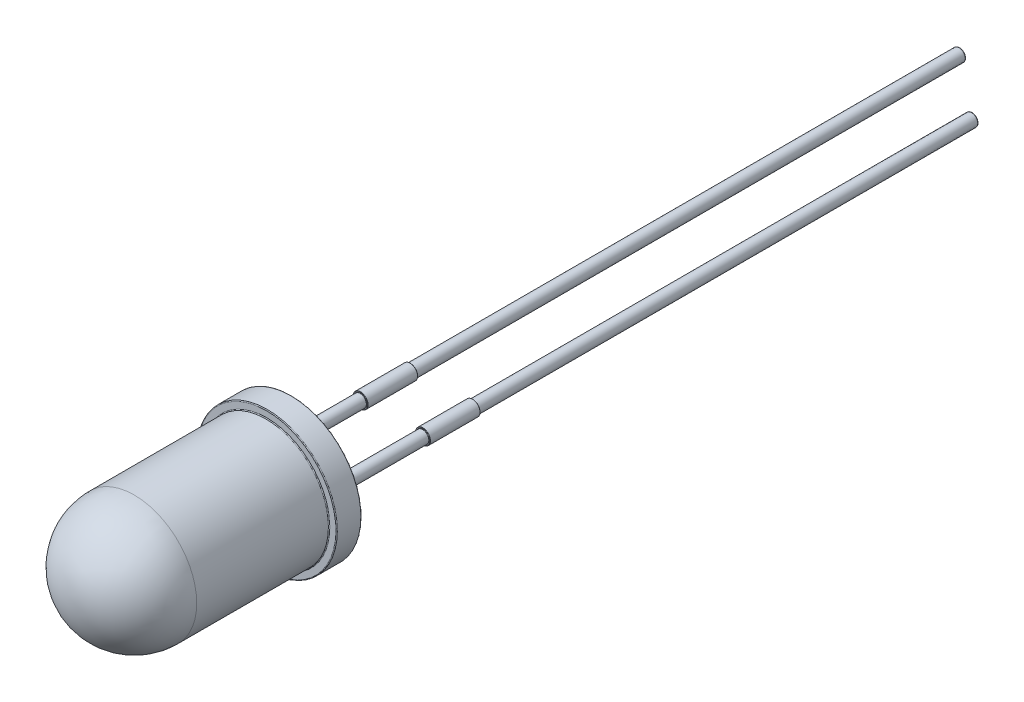
ISO-10303-21;
HEADER;
FILE_DESCRIPTION(('STEP AP214'),'2;1');
FILE_NAME('part.step','',(''),(''),'','','');
FILE_SCHEMA(('AUTOMOTIVE_DESIGN { 1 0 10303 214 1 1 1 1 }'));
ENDSEC;
DATA;
#1=APPLICATION_CONTEXT('core data for automotive mechanical design processes');
#2=APPLICATION_PROTOCOL_DEFINITION('international standard','automotive_design',2000,#1);
#3=PRODUCT_CONTEXT('',#1,'mechanical');
#4=PRODUCT('Part','Part','',(#3));
#5=PRODUCT_RELATED_PRODUCT_CATEGORY('part','',(#4));
#6=PRODUCT_DEFINITION_FORMATION('','',#4);
#7=PRODUCT_DEFINITION_CONTEXT('part definition',#1,'design');
#8=PRODUCT_DEFINITION('design','',#6,#7);
#9=PRODUCT_DEFINITION_SHAPE('','',#8);
#10=(LENGTH_UNIT() NAMED_UNIT(*) SI_UNIT(.MILLI.,.METRE.));
#11=(NAMED_UNIT(*) PLANE_ANGLE_UNIT() SI_UNIT($,.RADIAN.));
#12=(NAMED_UNIT(*) SI_UNIT($,.STERADIAN.) SOLID_ANGLE_UNIT());
#13=UNCERTAINTY_MEASURE_WITH_UNIT(LENGTH_MEASURE(1.E-05),#10,'distance_accuracy_value','');
#14=(GEOMETRIC_REPRESENTATION_CONTEXT(3) GLOBAL_UNCERTAINTY_ASSIGNED_CONTEXT((#13)) GLOBAL_UNIT_ASSIGNED_CONTEXT((#10,
#11,#12)) REPRESENTATION_CONTEXT('',''));
#15=CARTESIAN_POINT('',(0.,0.,0.));
#16=DIRECTION('',(0.,0.,1.));
#17=DIRECTION('',(1.,0.,0.));
#18=AXIS2_PLACEMENT_3D('',#15,#16,#17);
#19=CARTESIAN_POINT('',(-1.5,-0.25,2.));
#20=DIRECTION('',(0.,-1.,0.));
#21=DIRECTION('',(0.,0.,-1.));
#22=AXIS2_PLACEMENT_3D('',#19,#20,#21);
#23=PLANE('',#22);
#24=DIRECTION('',(1.,0.,0.));
#25=VECTOR('',#24,1.);
#26=CARTESIAN_POINT('',(-1.5,-0.25,1.));
#27=LINE('',#26,#25);
#28=CARTESIAN_POINT('',(-1.25,-0.25,1.));
#29=VERTEX_POINT('',#28);
#30=CARTESIAN_POINT('',(-0.75,-0.25,1.));
#31=VERTEX_POINT('',#30);
#32=EDGE_CURVE('P0_E57',#29,#31,#27,.T.);
#33=ORIENTED_EDGE('',*,*,#32,.T.);
#34=DIRECTION('',(0.6,0.,-0.8));
#35=VECTOR('',#34,1.);
#36=CARTESIAN_POINT('',(-2.25,-0.25,3.));
#37=LINE('',#36,#35);
#38=CARTESIAN_POINT('',(-2.25,-0.25,3.));
#39=VERTEX_POINT('',#38);
#40=EDGE_CURVE('P0_E84',#39,#31,#37,.T.);
#41=ORIENTED_EDGE('',*,*,#40,.F.);
#42=DIRECTION('',(0.,0.,1.));
#43=VECTOR('',#42,1.);
#44=CARTESIAN_POINT('',(-2.25,-0.25,1.));
#45=LINE('',#44,#43);
#46=CARTESIAN_POINT('',(-2.25,-0.25,1.));
#47=VERTEX_POINT('',#46);
#48=EDGE_CURVE('P0_E75',#47,#39,#45,.T.);
#49=ORIENTED_EDGE('',*,*,#48,.F.);
#50=DIRECTION('',(1.,0.,0.));
#51=VECTOR('',#50,1.);
#52=CARTESIAN_POINT('',(-1.5,-0.25,1.));
#53=LINE('',#52,#51);
#54=EDGE_CURVE('P0_E65',#47,#29,#53,.T.);
#55=ORIENTED_EDGE('',*,*,#54,.T.);
#56=EDGE_LOOP('',(#33,#41,#49,#55));
#57=FACE_BOUND('',#56,.T.);
#58=ADVANCED_FACE('P0_F16',(#57),#23,.T.);
#59=CARTESIAN_POINT('',(-2.25,0.,1.));
#60=DIRECTION('',(-1.,0.,0.));
#61=DIRECTION('',(0.,0.,1.));
#62=AXIS2_PLACEMENT_3D('',#59,#60,#61);
#63=PLANE('',#62);
#64=DIRECTION('',(0.,1.,0.));
#65=VECTOR('',#64,1.);
#66=CARTESIAN_POINT('',(-2.25,0.,1.));
#67=LINE('',#66,#65);
#68=CARTESIAN_POINT('',(-2.25,0.25,1.));
#69=VERTEX_POINT('',#68);
#70=EDGE_CURVE('P0_E40',#69,#47,#67,.F.);
#71=ORIENTED_EDGE('',*,*,#70,.T.);
#72=ORIENTED_EDGE('',*,*,#48,.T.);
#73=DIRECTION('',(0.,1.,0.));
#74=VECTOR('',#73,1.);
#75=CARTESIAN_POINT('',(-2.25,0.,3.));
#76=LINE('',#75,#74);
#77=CARTESIAN_POINT('',(-2.25,0.25,3.));
#78=VERTEX_POINT('',#77);
#79=EDGE_CURVE('P0_E87',#78,#39,#76,.F.);
#80=ORIENTED_EDGE('',*,*,#79,.F.);
#81=DIRECTION('',(0.,0.,1.));
#82=VECTOR('',#81,1.);
#83=CARTESIAN_POINT('',(-2.25,0.25,2.));
#84=LINE('',#83,#82);
#85=EDGE_CURVE('P0_E86',#69,#78,#84,.T.);
#86=ORIENTED_EDGE('',*,*,#85,.F.);
#87=EDGE_LOOP('',(#71,#72,#80,#86));
#88=FACE_BOUND('',#87,.T.);
#89=ADVANCED_FACE('P0_F354',(#88),#63,.T.);
#90=CARTESIAN_POINT('',(-2.25,0.,3.));
#91=DIRECTION('',(0.8,0.,0.6));
#92=DIRECTION('',(0.6,0.,-0.8));
#93=AXIS2_PLACEMENT_3D('',#90,#91,#92);
#94=PLANE('',#93);
#95=ORIENTED_EDGE('',*,*,#79,.T.);
#96=ORIENTED_EDGE('',*,*,#40,.T.);
#97=DIRECTION('',(0.,1.,0.));
#98=VECTOR('',#97,1.);
#99=CARTESIAN_POINT('',(-0.75,0.,1.));
#100=LINE('',#99,#98);
#101=CARTESIAN_POINT('',(-0.749999999999999,0.25,1.));
#102=VERTEX_POINT('',#101);
#103=EDGE_CURVE('P0_E60',#31,#102,#100,.T.);
#104=ORIENTED_EDGE('',*,*,#103,.T.);
#105=DIRECTION('',(0.6,0.,-0.8));
#106=VECTOR('',#105,1.);
#107=CARTESIAN_POINT('',(-2.25,0.25,3.));
#108=LINE('',#107,#106);
#109=EDGE_CURVE('P0_E103',#78,#102,#108,.T.);
#110=ORIENTED_EDGE('',*,*,#109,.F.);
#111=EDGE_LOOP('',(#95,#96,#104,#110));
#112=FACE_BOUND('',#111,.T.);
#113=ADVANCED_FACE('P0_F344',(#112),#94,.T.);
#114=CARTESIAN_POINT('',(-1.5,0.25,2.));
#115=DIRECTION('',(0.,1.,0.));
#116=DIRECTION('',(0.,0.,1.));
#117=AXIS2_PLACEMENT_3D('',#114,#115,#116);
#118=PLANE('',#117);
#119=DIRECTION('',(-1.,0.,0.));
#120=VECTOR('',#119,1.);
#121=CARTESIAN_POINT('',(-0.749999999999999,0.25,1.));
#122=LINE('',#121,#120);
#123=CARTESIAN_POINT('',(-1.25,0.25,1.));
#124=VERTEX_POINT('',#123);
#125=EDGE_CURVE('P0_E106',#124,#102,#122,.F.);
#126=ORIENTED_EDGE('',*,*,#125,.F.);
#127=DIRECTION('',(-1.,0.,0.));
#128=VECTOR('',#127,1.);
#129=CARTESIAN_POINT('',(-0.749999999999999,0.25,1.));
#130=LINE('',#129,#128);
#131=EDGE_CURVE('P0_E69',#69,#124,#130,.F.);
#132=ORIENTED_EDGE('',*,*,#131,.F.);
#133=ORIENTED_EDGE('',*,*,#85,.T.);
#134=ORIENTED_EDGE('',*,*,#109,.T.);
#135=EDGE_LOOP('',(#126,#132,#133,#134));
#136=FACE_BOUND('',#135,.T.);
#137=ADVANCED_FACE('P0_F335',(#136),#118,.T.);
#138=CARTESIAN_POINT('',(-0.749999999999999,0.,1.));
#139=DIRECTION('',(0.,0.,-1.));
#140=DIRECTION('',(-1.,0.,0.));
#141=AXIS2_PLACEMENT_3D('',#138,#139,#140);
#142=PLANE('',#141);
#143=ORIENTED_EDGE('',*,*,#103,.F.);
#144=ORIENTED_EDGE('',*,*,#32,.F.);
#145=CARTESIAN_POINT('',(-1.25,0.,1.));
#146=DIRECTION('',(0.,0.,-1.));
#147=DIRECTION('',(-1.,0.,0.));
#148=AXIS2_PLACEMENT_3D('',#145,#146,#147);
#149=CIRCLE('',#148,0.25);
#150=EDGE_CURVE('P0_E19',#124,#29,#149,.T.);
#151=ORIENTED_EDGE('',*,*,#150,.F.);
#152=ORIENTED_EDGE('',*,*,#125,.T.);
#153=EDGE_LOOP('',(#143,#144,#151,#152));
#154=FACE_BOUND('',#153,.T.);
#155=ADVANCED_FACE('P0_F58',(#154),#142,.T.);
#156=CARTESIAN_POINT('',(-0.749999999999999,0.,1.));
#157=DIRECTION('',(0.,0.,-1.));
#158=DIRECTION('',(-1.,0.,0.));
#159=AXIS2_PLACEMENT_3D('',#156,#157,#158);
#160=PLANE('',#159);
#161=ORIENTED_EDGE('',*,*,#70,.F.);
#162=ORIENTED_EDGE('',*,*,#131,.T.);
#163=CARTESIAN_POINT('',(-1.25,0.,1.));
#164=DIRECTION('',(0.,0.,-1.));
#165=DIRECTION('',(-1.,0.,0.));
#166=AXIS2_PLACEMENT_3D('',#163,#164,#165);
#167=CIRCLE('',#166,0.25);
#168=EDGE_CURVE('P0_E31',#29,#124,#167,.T.);
#169=ORIENTED_EDGE('',*,*,#168,.F.);
#170=ORIENTED_EDGE('',*,*,#54,.F.);
#171=EDGE_LOOP('',(#161,#162,#169,#170));
#172=FACE_BOUND('',#171,.T.);
#173=ADVANCED_FACE('P0_F70',(#172),#160,.T.);
#174=CARTESIAN_POINT('',(-1.25,0.,1.));
#175=DIRECTION('',(0.,0.,-1.));
#176=DIRECTION('',(-1.,0.,0.));
#177=AXIS2_PLACEMENT_3D('',#174,#175,#176);
#178=CYLINDRICAL_SURFACE('',#177,0.25);
#179=ORIENTED_EDGE('',*,*,#168,.T.);
#180=ORIENTED_EDGE('',*,*,#150,.T.);
#181=EDGE_LOOP('',(#179,#180));
#182=FACE_BOUND('',#181,.T.);
#183=CARTESIAN_POINT('',(-1.25,0.,-3.99));
#184=DIRECTION('',(0.,0.,1.));
#185=DIRECTION('',(1.,0.,0.));
#186=AXIS2_PLACEMENT_3D('',#183,#184,#185);
#187=CIRCLE('',#186,0.25);
#188=CARTESIAN_POINT('',(-1.,0.,-3.99));
#189=VERTEX_POINT('',#188);
#190=EDGE_CURVE('P0_E73',#189,#189,#187,.T.);
#191=ORIENTED_EDGE('',*,*,#190,.T.);
#192=EDGE_LOOP('',(#191));
#193=FACE_BOUND('',#192,.T.);
#194=ADVANCED_FACE('P0_F67',(#182,#193),#178,.T.);
#195=CARTESIAN_POINT('',(-1.25,0.,-3.99));
#196=DIRECTION('',(0.,0.,1.));
#197=DIRECTION('',(1.,0.,0.));
#198=AXIS2_PLACEMENT_3D('',#195,#196,#197);
#199=TOROIDAL_SURFACE('',#198,0.26,0.01);
#200=CARTESIAN_POINT('',(-1.25,0.,-4.));
#201=DIRECTION('',(0.,0.,1.));
#202=DIRECTION('',(-1.,0.,0.));
#203=AXIS2_PLACEMENT_3D('',#200,#201,#202);
#204=CIRCLE('',#203,0.26);
#205=CARTESIAN_POINT('',(-1.51,0.,-4.));
#206=VERTEX_POINT('',#205);
#207=EDGE_CURVE('P0_E145',#206,#206,#204,.F.);
#208=ORIENTED_EDGE('',*,*,#207,.F.);
#209=EDGE_LOOP('',(#208));
#210=FACE_BOUND('',#209,.T.);
#211=ORIENTED_EDGE('',*,*,#190,.F.);
#212=EDGE_LOOP('',(#211));
#213=FACE_BOUND('',#212,.T.);
#214=ADVANCED_FACE('P0_F123',(#210,#213),#199,.F.);
#215=CARTESIAN_POINT('',(-1.,0.,-4.));
#216=DIRECTION('',(0.,0.,1.));
#217=DIRECTION('',(1.,0.,0.));
#218=AXIS2_PLACEMENT_3D('',#215,#216,#217);
#219=PLANE('',#218);
#220=ORIENTED_EDGE('',*,*,#207,.T.);
#221=EDGE_LOOP('',(#220));
#222=FACE_BOUND('',#221,.T.);
#223=CARTESIAN_POINT('',(-1.25,0.,-4.));
#224=DIRECTION('',(0.,0.,-1.));
#225=DIRECTION('',(-1.,0.,0.));
#226=AXIS2_PLACEMENT_3D('',#223,#224,#225);
#227=CIRCLE('',#226,0.29);
#228=CARTESIAN_POINT('',(-1.54,0.,-4.));
#229=VERTEX_POINT('',#228);
#230=EDGE_CURVE('P0_E148',#229,#229,#227,.T.);
#231=ORIENTED_EDGE('',*,*,#230,.F.);
#232=EDGE_LOOP('',(#231));
#233=FACE_BOUND('',#232,.T.);
#234=ADVANCED_FACE('P0_F134',(#222,#233),#219,.T.);
#235=CARTESIAN_POINT('',(-1.25,0.,-4.01));
#236=DIRECTION('',(0.,0.,1.));
#237=DIRECTION('',(1.,0.,0.));
#238=AXIS2_PLACEMENT_3D('',#235,#236,#237);
#239=TOROIDAL_SURFACE('',#238,0.29,0.01);
#240=CARTESIAN_POINT('',(-1.25,0.,-4.01));
#241=DIRECTION('',(0.,0.,1.));
#242=DIRECTION('',(1.,0.,0.));
#243=AXIS2_PLACEMENT_3D('',#240,#241,#242);
#244=CIRCLE('',#243,0.3);
#245=CARTESIAN_POINT('',(-0.95,0.,-4.01));
#246=VERTEX_POINT('',#245);
#247=EDGE_CURVE('P0_E152',#246,#246,#244,.F.);
#248=ORIENTED_EDGE('',*,*,#247,.F.);
#249=EDGE_LOOP('',(#248));
#250=FACE_BOUND('',#249,.T.);
#251=ORIENTED_EDGE('',*,*,#230,.T.);
#252=EDGE_LOOP('',(#251));
#253=FACE_BOUND('',#252,.T.);
#254=ADVANCED_FACE('P0_F172',(#250,#253),#239,.T.);
#255=CARTESIAN_POINT('',(-1.25,0.,-5.));
#256=DIRECTION('',(0.,0.,1.));
#257=DIRECTION('',(1.,0.,0.));
#258=AXIS2_PLACEMENT_3D('',#255,#256,#257);
#259=CYLINDRICAL_SURFACE('',#258,0.3);
#260=CARTESIAN_POINT('',(-1.25,0.,-5.99));
#261=DIRECTION('',(0.,0.,1.));
#262=DIRECTION('',(1.,0.,0.));
#263=AXIS2_PLACEMENT_3D('',#260,#261,#262);
#264=CIRCLE('',#263,0.3);
#265=CARTESIAN_POINT('',(-0.95,0.,-5.99));
#266=VERTEX_POINT('',#265);
#267=EDGE_CURVE('P0_E156',#266,#266,#264,.F.);
#268=ORIENTED_EDGE('',*,*,#267,.F.);
#269=EDGE_LOOP('',(#268));
#270=FACE_BOUND('',#269,.T.);
#271=ORIENTED_EDGE('',*,*,#247,.T.);
#272=EDGE_LOOP('',(#271));
#273=FACE_BOUND('',#272,.T.);
#274=ADVANCED_FACE('P0_F176',(#270,#273),#259,.T.);
#275=CARTESIAN_POINT('',(-1.25,0.,-5.99));
#276=DIRECTION('',(0.,0.,1.));
#277=DIRECTION('',(1.,0.,0.));
#278=AXIS2_PLACEMENT_3D('',#275,#276,#277);
#279=TOROIDAL_SURFACE('',#278,0.29,0.01);
#280=CARTESIAN_POINT('',(-1.25,0.,-6.));
#281=DIRECTION('',(0.,0.,1.));
#282=DIRECTION('',(-1.,0.,0.));
#283=AXIS2_PLACEMENT_3D('',#280,#281,#282);
#284=CIRCLE('',#283,0.29);
#285=CARTESIAN_POINT('',(-1.54,0.,-6.));
#286=VERTEX_POINT('',#285);
#287=EDGE_CURVE('P0_E161',#286,#286,#284,.F.);
#288=ORIENTED_EDGE('',*,*,#287,.F.);
#289=EDGE_LOOP('',(#288));
#290=FACE_BOUND('',#289,.T.);
#291=ORIENTED_EDGE('',*,*,#267,.T.);
#292=EDGE_LOOP('',(#291));
#293=FACE_BOUND('',#292,.T.);
#294=ADVANCED_FACE('P0_F179',(#290,#293),#279,.T.);
#295=CARTESIAN_POINT('',(-1.25,0.,-28.));
#296=DIRECTION('',(0.,0.,-1.));
#297=DIRECTION('',(-1.,0.,0.));
#298=AXIS2_PLACEMENT_3D('',#295,#296,#297);
#299=PLANE('',#298);
#300=CARTESIAN_POINT('',(-1.25,0.,-28.));
#301=DIRECTION('',(0.,0.,1.));
#302=DIRECTION('',(1.,0.,0.));
#303=AXIS2_PLACEMENT_3D('',#300,#301,#302);
#304=CIRCLE('',#303,0.21);
#305=CARTESIAN_POINT('',(-1.04,0.,-28.));
#306=VERTEX_POINT('',#305);
#307=EDGE_CURVE('P0_E200',#306,#306,#304,.T.);
#308=ORIENTED_EDGE('',*,*,#307,.F.);
#309=EDGE_LOOP('',(#308));
#310=FACE_BOUND('',#309,.T.);
#311=ADVANCED_FACE('P0_F185',(#310),#299,.T.);
#312=CARTESIAN_POINT('',(-0.95,0.,-6.));
#313=DIRECTION('',(0.,0.,-1.));
#314=DIRECTION('',(-1.,0.,0.));
#315=AXIS2_PLACEMENT_3D('',#312,#313,#314);
#316=PLANE('',#315);
#317=CARTESIAN_POINT('',(-1.25,0.,-6.));
#318=DIRECTION('',(0.,0.,-1.));
#319=DIRECTION('',(1.,0.,0.));
#320=AXIS2_PLACEMENT_3D('',#317,#318,#319);
#321=CIRCLE('',#320,0.26);
#322=CARTESIAN_POINT('',(-0.99,0.,-6.));
#323=VERTEX_POINT('',#322);
#324=EDGE_CURVE('P0_E202',#323,#323,#321,.F.);
#325=ORIENTED_EDGE('',*,*,#324,.T.);
#326=EDGE_LOOP('',(#325));
#327=FACE_BOUND('',#326,.T.);
#328=ORIENTED_EDGE('',*,*,#287,.T.);
#329=EDGE_LOOP('',(#328));
#330=FACE_BOUND('',#329,.T.);
#331=ADVANCED_FACE('P0_F247',(#327,#330),#316,.T.);
#332=CARTESIAN_POINT('',(-1.25,0.,-27.96));
#333=DIRECTION('',(0.,0.,-1.));
#334=DIRECTION('',(-1.,0.,0.));
#335=AXIS2_PLACEMENT_3D('',#332,#333,#334);
#336=TOROIDAL_SURFACE('',#335,0.21,0.04);
#337=CARTESIAN_POINT('',(-1.25,0.,-27.96));
#338=DIRECTION('',(0.,0.,-1.));
#339=DIRECTION('',(-1.,0.,0.));
#340=AXIS2_PLACEMENT_3D('',#337,#338,#339);
#341=CIRCLE('',#340,0.25);
#342=CARTESIAN_POINT('',(-1.5,0.,-27.96));
#343=VERTEX_POINT('',#342);
#344=EDGE_CURVE('P0_E24',#343,#343,#341,.F.);
#345=ORIENTED_EDGE('',*,*,#344,.F.);
#346=EDGE_LOOP('',(#345));
#347=FACE_BOUND('',#346,.T.);
#348=ORIENTED_EDGE('',*,*,#307,.T.);
#349=EDGE_LOOP('',(#348));
#350=FACE_BOUND('',#349,.T.);
#351=ADVANCED_FACE('P0_F223',(#347,#350),#336,.T.);
#352=CARTESIAN_POINT('',(-1.25,0.,-6.01));
#353=DIRECTION('',(0.,0.,-1.));
#354=DIRECTION('',(-1.,0.,0.));
#355=AXIS2_PLACEMENT_3D('',#352,#353,#354);
#356=TOROIDAL_SURFACE('',#355,0.26,0.01);
#357=ORIENTED_EDGE('',*,*,#324,.F.);
#358=EDGE_LOOP('',(#357));
#359=FACE_BOUND('',#358,.T.);
#360=CARTESIAN_POINT('',(-1.25,0.,-6.01));
#361=DIRECTION('',(0.,0.,-1.));
#362=DIRECTION('',(-1.,0.,0.));
#363=AXIS2_PLACEMENT_3D('',#360,#361,#362);
#364=CIRCLE('',#363,0.25);
#365=CARTESIAN_POINT('',(-1.5,0.,-6.01));
#366=VERTEX_POINT('',#365);
#367=EDGE_CURVE('P0_E11',#366,#366,#364,.T.);
#368=ORIENTED_EDGE('',*,*,#367,.F.);
#369=EDGE_LOOP('',(#368));
#370=FACE_BOUND('',#369,.T.);
#371=ADVANCED_FACE('P0_F218',(#359,#370),#356,.F.);
#372=CARTESIAN_POINT('',(-1.25,0.,1.));
#373=DIRECTION('',(0.,0.,-1.));
#374=DIRECTION('',(-1.,0.,0.));
#375=AXIS2_PLACEMENT_3D('',#372,#373,#374);
#376=CYLINDRICAL_SURFACE('',#375,0.25);
#377=ORIENTED_EDGE('',*,*,#367,.T.);
#378=EDGE_LOOP('',(#377));
#379=FACE_BOUND('',#378,.T.);
#380=ORIENTED_EDGE('',*,*,#344,.T.);
#381=EDGE_LOOP('',(#380));
#382=FACE_BOUND('',#381,.T.);
#383=ADVANCED_FACE('P0_F222',(#379,#382),#376,.T.);
#384=CLOSED_SHELL('',(#58,#89,#113,#137,#155,#173,#194,#214,#234,#254,#274,#294,#311,#331,#351,
#371,#383));
#385=MANIFOLD_SOLID_BREP('P0_B1',#384);
#386=CARTESIAN_POINT('',(0.15625,-0.25,2.));
#387=DIRECTION('',(0.,-1.,0.));
#388=DIRECTION('',(0.,0.,-1.));
#389=AXIS2_PLACEMENT_3D('',#386,#387,#388);
#390=PLANE('',#389);
#391=DIRECTION('',(0.,0.,-1.));
#392=VECTOR('',#391,1.);
#393=CARTESIAN_POINT('',(2.25,-0.25,3.));
#394=LINE('',#393,#392);
#395=CARTESIAN_POINT('',(2.25,-0.25,3.));
#396=VERTEX_POINT('',#395);
#397=CARTESIAN_POINT('',(2.25,-0.25,1.));
#398=VERTEX_POINT('',#397);
#399=EDGE_CURVE('P1_E91',#396,#398,#394,.T.);
#400=ORIENTED_EDGE('',*,*,#399,.F.);
#401=DIRECTION('',(1.,0.,0.));
#402=VECTOR('',#401,1.);
#403=CARTESIAN_POINT('',(-1.9375,-0.25,3.));
#404=LINE('',#403,#402);
#405=CARTESIAN_POINT('',(-1.9375,-0.25,3.));
#406=VERTEX_POINT('',#405);
#407=EDGE_CURVE('P1_E97',#406,#396,#404,.T.);
#408=ORIENTED_EDGE('',*,*,#407,.F.);
#409=DIRECTION('',(-0.6,0.,0.8));
#410=VECTOR('',#409,1.);
#411=CARTESIAN_POINT('',(-0.437499999999999,-0.25,1.));
#412=LINE('',#411,#410);
#413=CARTESIAN_POINT('',(-0.437499999999999,-0.25,1.));
#414=VERTEX_POINT('',#413);
#415=EDGE_CURVE('P1_E78',#414,#406,#412,.T.);
#416=ORIENTED_EDGE('',*,*,#415,.F.);
#417=DIRECTION('',(1.,0.,0.));
#418=VECTOR('',#417,1.);
#419=CARTESIAN_POINT('',(0.15625,-0.25,1.));
#420=LINE('',#419,#418);
#421=CARTESIAN_POINT('',(1.25,-0.25,1.));
#422=VERTEX_POINT('',#421);
#423=EDGE_CURVE('P1_E67',#414,#422,#420,.T.);
#424=ORIENTED_EDGE('',*,*,#423,.T.);
#425=DIRECTION('',(1.,0.,0.));
#426=VECTOR('',#425,1.);
#427=CARTESIAN_POINT('',(0.15625,-0.25,1.));
#428=LINE('',#427,#426);
#429=EDGE_CURVE('P1_E59',#422,#398,#428,.T.);
#430=ORIENTED_EDGE('',*,*,#429,.T.);
#431=EDGE_LOOP('',(#400,#408,#416,#424,#430));
#432=FACE_BOUND('',#431,.T.);
#433=ADVANCED_FACE('P1_F16',(#432),#390,.T.);
#434=CARTESIAN_POINT('',(-0.437499999999999,0.,1.));
#435=DIRECTION('',(-0.8,0.,-0.6));
#436=DIRECTION('',(-0.6,0.,0.8));
#437=AXIS2_PLACEMENT_3D('',#434,#435,#436);
#438=PLANE('',#437);
#439=DIRECTION('',(0.,1.,0.));
#440=VECTOR('',#439,1.);
#441=CARTESIAN_POINT('',(-0.437499999999999,0.,1.));
#442=LINE('',#441,#440);
#443=CARTESIAN_POINT('',(-0.437499999999999,0.25,1.));
#444=VERTEX_POINT('',#443);
#445=EDGE_CURVE('P1_E40',#444,#414,#442,.F.);
#446=ORIENTED_EDGE('',*,*,#445,.T.);
#447=ORIENTED_EDGE('',*,*,#415,.T.);
#448=DIRECTION('',(0.,1.,0.));
#449=VECTOR('',#448,1.);
#450=CARTESIAN_POINT('',(-1.9375,0.,3.));
#451=LINE('',#450,#449);
#452=CARTESIAN_POINT('',(-1.9375,0.25,3.));
#453=VERTEX_POINT('',#452);
#454=EDGE_CURVE('P1_E86',#453,#406,#451,.F.);
#455=ORIENTED_EDGE('',*,*,#454,.F.);
#456=DIRECTION('',(-0.6,0.,0.8));
#457=VECTOR('',#456,1.);
#458=CARTESIAN_POINT('',(-0.437499999999999,0.25,1.));
#459=LINE('',#458,#457);
#460=EDGE_CURVE('P1_E93',#444,#453,#459,.T.);
#461=ORIENTED_EDGE('',*,*,#460,.F.);
#462=EDGE_LOOP('',(#446,#447,#455,#461));
#463=FACE_BOUND('',#462,.T.);
#464=ADVANCED_FACE('P1_F382',(#463),#438,.T.);
#465=CARTESIAN_POINT('',(-1.9375,0.,3.));
#466=DIRECTION('',(0.,0.,1.));
#467=DIRECTION('',(1.,0.,0.));
#468=AXIS2_PLACEMENT_3D('',#465,#466,#467);
#469=PLANE('',#468);
#470=ORIENTED_EDGE('',*,*,#454,.T.);
#471=ORIENTED_EDGE('',*,*,#407,.T.);
#472=DIRECTION('',(0.,1.,0.));
#473=VECTOR('',#472,1.);
#474=CARTESIAN_POINT('',(2.25,0.,3.));
#475=LINE('',#474,#473);
#476=CARTESIAN_POINT('',(2.25,0.25,3.));
#477=VERTEX_POINT('',#476);
#478=EDGE_CURVE('P1_E94',#477,#396,#475,.F.);
#479=ORIENTED_EDGE('',*,*,#478,.F.);
#480=DIRECTION('',(1.,0.,0.));
#481=VECTOR('',#480,1.);
#482=CARTESIAN_POINT('',(0.15625,0.25,3.));
#483=LINE('',#482,#481);
#484=EDGE_CURVE('P1_E109',#453,#477,#483,.T.);
#485=ORIENTED_EDGE('',*,*,#484,.F.);
#486=EDGE_LOOP('',(#470,#471,#479,#485));
#487=FACE_BOUND('',#486,.T.);
#488=ADVANCED_FACE('P1_F372',(#487),#469,.T.);
#489=CARTESIAN_POINT('',(2.25,0.,3.));
#490=DIRECTION('',(1.,0.,0.));
#491=DIRECTION('',(0.,0.,-1.));
#492=AXIS2_PLACEMENT_3D('',#489,#490,#491);
#493=PLANE('',#492);
#494=ORIENTED_EDGE('',*,*,#478,.T.);
#495=ORIENTED_EDGE('',*,*,#399,.T.);
#496=DIRECTION('',(0.,1.,0.));
#497=VECTOR('',#496,1.);
#498=CARTESIAN_POINT('',(2.25,0.,1.));
#499=LINE('',#498,#497);
#500=CARTESIAN_POINT('',(2.25,0.25,1.));
#501=VERTEX_POINT('',#500);
#502=EDGE_CURVE('P1_E62',#398,#501,#499,.T.);
#503=ORIENTED_EDGE('',*,*,#502,.T.);
#504=DIRECTION('',(0.,0.,1.));
#505=VECTOR('',#504,1.);
#506=CARTESIAN_POINT('',(2.25,0.25,2.));
#507=LINE('',#506,#505);
#508=EDGE_CURVE('P1_E112',#477,#501,#507,.F.);
#509=ORIENTED_EDGE('',*,*,#508,.F.);
#510=EDGE_LOOP('',(#494,#495,#503,#509));
#511=FACE_BOUND('',#510,.T.);
#512=ADVANCED_FACE('P1_F362',(#511),#493,.T.);
#513=CARTESIAN_POINT('',(0.15625,0.25,2.));
#514=DIRECTION('',(0.,1.,0.));
#515=DIRECTION('',(0.,0.,1.));
#516=AXIS2_PLACEMENT_3D('',#513,#514,#515);
#517=PLANE('',#516);
#518=DIRECTION('',(-1.,0.,0.));
#519=VECTOR('',#518,1.);
#520=CARTESIAN_POINT('',(2.25,0.25,1.));
#521=LINE('',#520,#519);
#522=CARTESIAN_POINT('',(1.25,0.25,1.));
#523=VERTEX_POINT('',#522);
#524=EDGE_CURVE('P1_E124',#523,#501,#521,.F.);
#525=ORIENTED_EDGE('',*,*,#524,.F.);
#526=DIRECTION('',(-1.,0.,0.));
#527=VECTOR('',#526,1.);
#528=CARTESIAN_POINT('',(2.25,0.25,1.));
#529=LINE('',#528,#527);
#530=EDGE_CURVE('P1_E71',#444,#523,#529,.F.);
#531=ORIENTED_EDGE('',*,*,#530,.F.);
#532=ORIENTED_EDGE('',*,*,#460,.T.);
#533=ORIENTED_EDGE('',*,*,#484,.T.);
#534=ORIENTED_EDGE('',*,*,#508,.T.);
#535=EDGE_LOOP('',(#525,#531,#532,#533,#534));
#536=FACE_BOUND('',#535,.T.);
#537=ADVANCED_FACE('P1_F353',(#536),#517,.T.);
#538=CARTESIAN_POINT('',(2.25,0.,1.));
#539=DIRECTION('',(0.,0.,-1.));
#540=DIRECTION('',(-1.,0.,0.));
#541=AXIS2_PLACEMENT_3D('',#538,#539,#540);
#542=PLANE('',#541);
#543=ORIENTED_EDGE('',*,*,#502,.F.);
#544=ORIENTED_EDGE('',*,*,#429,.F.);
#545=CARTESIAN_POINT('',(1.25,0.,1.));
#546=DIRECTION('',(0.,0.,-1.));
#547=DIRECTION('',(-1.,0.,0.));
#548=AXIS2_PLACEMENT_3D('',#545,#546,#547);
#549=CIRCLE('',#548,0.25);
#550=EDGE_CURVE('P1_E19',#523,#422,#549,.T.);
#551=ORIENTED_EDGE('',*,*,#550,.F.);
#552=ORIENTED_EDGE('',*,*,#524,.T.);
#553=EDGE_LOOP('',(#543,#544,#551,#552));
#554=FACE_BOUND('',#553,.T.);
#555=ADVANCED_FACE('P1_F60',(#554),#542,.T.);
#556=CARTESIAN_POINT('',(2.25,0.,1.));
#557=DIRECTION('',(0.,0.,-1.));
#558=DIRECTION('',(-1.,0.,0.));
#559=AXIS2_PLACEMENT_3D('',#556,#557,#558);
#560=PLANE('',#559);
#561=ORIENTED_EDGE('',*,*,#445,.F.);
#562=ORIENTED_EDGE('',*,*,#530,.T.);
#563=CARTESIAN_POINT('',(1.25,0.,1.));
#564=DIRECTION('',(0.,0.,-1.));
#565=DIRECTION('',(-1.,0.,0.));
#566=AXIS2_PLACEMENT_3D('',#563,#564,#565);
#567=CIRCLE('',#566,0.25);
#568=EDGE_CURVE('P1_E31',#422,#523,#567,.T.);
#569=ORIENTED_EDGE('',*,*,#568,.F.);
#570=ORIENTED_EDGE('',*,*,#423,.F.);
#571=EDGE_LOOP('',(#561,#562,#569,#570));
#572=FACE_BOUND('',#571,.T.);
#573=ADVANCED_FACE('P1_F72',(#572),#560,.T.);
#574=CARTESIAN_POINT('',(1.25,0.,1.));
#575=DIRECTION('',(0.,0.,-1.));
#576=DIRECTION('',(-1.,0.,0.));
#577=AXIS2_PLACEMENT_3D('',#574,#575,#576);
#578=CYLINDRICAL_SURFACE('',#577,0.25);
#579=ORIENTED_EDGE('',*,*,#568,.T.);
#580=ORIENTED_EDGE('',*,*,#550,.T.);
#581=EDGE_LOOP('',(#579,#580));
#582=FACE_BOUND('',#581,.T.);
#583=CARTESIAN_POINT('',(1.25,0.,-3.99));
#584=DIRECTION('',(0.,0.,1.));
#585=DIRECTION('',(1.,0.,0.));
#586=AXIS2_PLACEMENT_3D('',#583,#584,#585);
#587=CIRCLE('',#586,0.25);
#588=CARTESIAN_POINT('',(1.5,0.,-3.99));
#589=VERTEX_POINT('',#588);
#590=EDGE_CURVE('P1_E75',#589,#589,#587,.T.);
#591=ORIENTED_EDGE('',*,*,#590,.T.);
#592=EDGE_LOOP('',(#591));
#593=FACE_BOUND('',#592,.T.);
#594=ADVANCED_FACE('P1_F69',(#582,#593),#578,.T.);
#595=CARTESIAN_POINT('',(1.25,0.,-3.99));
#596=DIRECTION('',(0.,0.,1.));
#597=DIRECTION('',(1.,0.,0.));
#598=AXIS2_PLACEMENT_3D('',#595,#596,#597);
#599=TOROIDAL_SURFACE('',#598,0.26,0.01);
#600=CARTESIAN_POINT('',(1.25,0.,-4.));
#601=DIRECTION('',(0.,0.,1.));
#602=DIRECTION('',(-1.,0.,0.));
#603=AXIS2_PLACEMENT_3D('',#600,#601,#602);
#604=CIRCLE('',#603,0.26);
#605=CARTESIAN_POINT('',(0.99,0.,-4.));
#606=VERTEX_POINT('',#605);
#607=EDGE_CURVE('P1_E163',#606,#606,#604,.F.);
#608=ORIENTED_EDGE('',*,*,#607,.F.);
#609=EDGE_LOOP('',(#608));
#610=FACE_BOUND('',#609,.T.);
#611=ORIENTED_EDGE('',*,*,#590,.F.);
#612=EDGE_LOOP('',(#611));
#613=FACE_BOUND('',#612,.T.);
#614=ADVANCED_FACE('P1_F141',(#610,#613),#599,.F.);
#615=CARTESIAN_POINT('',(1.5,0.,-4.));
#616=DIRECTION('',(0.,0.,1.));
#617=DIRECTION('',(1.,0.,0.));
#618=AXIS2_PLACEMENT_3D('',#615,#616,#617);
#619=PLANE('',#618);
#620=ORIENTED_EDGE('',*,*,#607,.T.);
#621=EDGE_LOOP('',(#620));
#622=FACE_BOUND('',#621,.T.);
#623=CARTESIAN_POINT('',(1.25,0.,-4.));
#624=DIRECTION('',(0.,0.,-1.));
#625=DIRECTION('',(-1.,0.,0.));
#626=AXIS2_PLACEMENT_3D('',#623,#624,#625);
#627=CIRCLE('',#626,0.29);
#628=CARTESIAN_POINT('',(0.96,0.,-4.));
#629=VERTEX_POINT('',#628);
#630=EDGE_CURVE('P1_E166',#629,#629,#627,.T.);
#631=ORIENTED_EDGE('',*,*,#630,.F.);
#632=EDGE_LOOP('',(#631));
#633=FACE_BOUND('',#632,.T.);
#634=ADVANCED_FACE('P1_F152',(#622,#633),#619,.T.);
#635=CARTESIAN_POINT('',(1.25,0.,-4.01));
#636=DIRECTION('',(0.,0.,1.));
#637=DIRECTION('',(1.,0.,0.));
#638=AXIS2_PLACEMENT_3D('',#635,#636,#637);
#639=TOROIDAL_SURFACE('',#638,0.29,0.01);
#640=CARTESIAN_POINT('',(1.25,0.,-4.01));
#641=DIRECTION('',(0.,0.,1.));
#642=DIRECTION('',(1.,0.,0.));
#643=AXIS2_PLACEMENT_3D('',#640,#641,#642);
#644=CIRCLE('',#643,0.3);
#645=CARTESIAN_POINT('',(1.55,0.,-4.01));
#646=VERTEX_POINT('',#645);
#647=EDGE_CURVE('P1_E170',#646,#646,#644,.F.);
#648=ORIENTED_EDGE('',*,*,#647,.F.);
#649=EDGE_LOOP('',(#648));
#650=FACE_BOUND('',#649,.T.);
#651=ORIENTED_EDGE('',*,*,#630,.T.);
#652=EDGE_LOOP('',(#651));
#653=FACE_BOUND('',#652,.T.);
#654=ADVANCED_FACE('P1_F190',(#650,#653),#639,.T.);
#655=CARTESIAN_POINT('',(1.25,0.,-5.));
#656=DIRECTION('',(0.,0.,1.));
#657=DIRECTION('',(1.,0.,0.));
#658=AXIS2_PLACEMENT_3D('',#655,#656,#657);
#659=CYLINDRICAL_SURFACE('',#658,0.3);
#660=CARTESIAN_POINT('',(1.25,0.,-5.99));
#661=DIRECTION('',(0.,0.,1.));
#662=DIRECTION('',(1.,0.,0.));
#663=AXIS2_PLACEMENT_3D('',#660,#661,#662);
#664=CIRCLE('',#663,0.3);
#665=CARTESIAN_POINT('',(1.55,0.,-5.99));
#666=VERTEX_POINT('',#665);
#667=EDGE_CURVE('P1_E174',#666,#666,#664,.F.);
#668=ORIENTED_EDGE('',*,*,#667,.F.);
#669=EDGE_LOOP('',(#668));
#670=FACE_BOUND('',#669,.T.);
#671=ORIENTED_EDGE('',*,*,#647,.T.);
#672=EDGE_LOOP('',(#671));
#673=FACE_BOUND('',#672,.T.);
#674=ADVANCED_FACE('P1_F194',(#670,#673),#659,.T.);
#675=CARTESIAN_POINT('',(1.25,0.,-5.99));
#676=DIRECTION('',(0.,0.,1.));
#677=DIRECTION('',(1.,0.,0.));
#678=AXIS2_PLACEMENT_3D('',#675,#676,#677);
#679=TOROIDAL_SURFACE('',#678,0.29,0.01);
#680=CARTESIAN_POINT('',(1.25,0.,-6.));
#681=DIRECTION('',(0.,0.,1.));
#682=DIRECTION('',(-1.,0.,0.));
#683=AXIS2_PLACEMENT_3D('',#680,#681,#682);
#684=CIRCLE('',#683,0.29);
#685=CARTESIAN_POINT('',(0.96,0.,-6.));
#686=VERTEX_POINT('',#685);
#687=EDGE_CURVE('P1_E179',#686,#686,#684,.F.);
#688=ORIENTED_EDGE('',*,*,#687,.F.);
#689=EDGE_LOOP('',(#688));
#690=FACE_BOUND('',#689,.T.);
#691=ORIENTED_EDGE('',*,*,#667,.T.);
#692=EDGE_LOOP('',(#691));
#693=FACE_BOUND('',#692,.T.);
#694=ADVANCED_FACE('P1_F197',(#690,#693),#679,.T.);
#695=CARTESIAN_POINT('',(1.25,0.,-26.));
#696=DIRECTION('',(0.,0.,-1.));
#697=DIRECTION('',(-1.,0.,0.));
#698=AXIS2_PLACEMENT_3D('',#695,#696,#697);
#699=PLANE('',#698);
#700=CARTESIAN_POINT('',(1.25,0.,-26.));
#701=DIRECTION('',(0.,0.,1.));
#702=DIRECTION('',(1.,0.,0.));
#703=AXIS2_PLACEMENT_3D('',#700,#701,#702);
#704=CIRCLE('',#703,0.21);
#705=CARTESIAN_POINT('',(1.46,0.,-26.));
#706=VERTEX_POINT('',#705);
#707=EDGE_CURVE('P1_E218',#706,#706,#704,.T.);
#708=ORIENTED_EDGE('',*,*,#707,.F.);
#709=EDGE_LOOP('',(#708));
#710=FACE_BOUND('',#709,.T.);
#711=ADVANCED_FACE('P1_F203',(#710),#699,.T.);
#712=CARTESIAN_POINT('',(1.55,0.,-6.));
#713=DIRECTION('',(0.,0.,-1.));
#714=DIRECTION('',(-1.,0.,0.));
#715=AXIS2_PLACEMENT_3D('',#712,#713,#714);
#716=PLANE('',#715);
#717=CARTESIAN_POINT('',(1.25,0.,-6.));
#718=DIRECTION('',(0.,0.,-1.));
#719=DIRECTION('',(1.,0.,0.));
#720=AXIS2_PLACEMENT_3D('',#717,#718,#719);
#721=CIRCLE('',#720,0.26);
#722=CARTESIAN_POINT('',(1.51,0.,-6.));
#723=VERTEX_POINT('',#722);
#724=EDGE_CURVE('P1_E220',#723,#723,#721,.F.);
#725=ORIENTED_EDGE('',*,*,#724,.T.);
#726=EDGE_LOOP('',(#725));
#727=FACE_BOUND('',#726,.T.);
#728=ORIENTED_EDGE('',*,*,#687,.T.);
#729=EDGE_LOOP('',(#728));
#730=FACE_BOUND('',#729,.T.);
#731=ADVANCED_FACE('P1_F265',(#727,#730),#716,.T.);
#732=CARTESIAN_POINT('',(1.25,0.,-25.96));
#733=DIRECTION('',(0.,0.,-1.));
#734=DIRECTION('',(-1.,0.,0.));
#735=AXIS2_PLACEMENT_3D('',#732,#733,#734);
#736=TOROIDAL_SURFACE('',#735,0.21,0.04);
#737=CARTESIAN_POINT('',(1.25,0.,-25.96));
#738=DIRECTION('',(0.,0.,-1.));
#739=DIRECTION('',(-1.,0.,0.));
#740=AXIS2_PLACEMENT_3D('',#737,#738,#739);
#741=CIRCLE('',#740,0.25);
#742=CARTESIAN_POINT('',(1.,0.,-25.96));
#743=VERTEX_POINT('',#742);
#744=EDGE_CURVE('P1_E24',#743,#743,#741,.F.);
#745=ORIENTED_EDGE('',*,*,#744,.F.);
#746=EDGE_LOOP('',(#745));
#747=FACE_BOUND('',#746,.T.);
#748=ORIENTED_EDGE('',*,*,#707,.T.);
#749=EDGE_LOOP('',(#748));
#750=FACE_BOUND('',#749,.T.);
#751=ADVANCED_FACE('P1_F241',(#747,#750),#736,.T.);
#752=CARTESIAN_POINT('',(1.25,0.,-6.01));
#753=DIRECTION('',(0.,0.,-1.));
#754=DIRECTION('',(-1.,0.,0.));
#755=AXIS2_PLACEMENT_3D('',#752,#753,#754);
#756=TOROIDAL_SURFACE('',#755,0.26,0.01);
#757=ORIENTED_EDGE('',*,*,#724,.F.);
#758=EDGE_LOOP('',(#757));
#759=FACE_BOUND('',#758,.T.);
#760=CARTESIAN_POINT('',(1.25,0.,-6.01));
#761=DIRECTION('',(0.,0.,-1.));
#762=DIRECTION('',(-1.,0.,0.));
#763=AXIS2_PLACEMENT_3D('',#760,#761,#762);
#764=CIRCLE('',#763,0.25);
#765=CARTESIAN_POINT('',(1.,0.,-6.01));
#766=VERTEX_POINT('',#765);
#767=EDGE_CURVE('P1_E11',#766,#766,#764,.T.);
#768=ORIENTED_EDGE('',*,*,#767,.F.);
#769=EDGE_LOOP('',(#768));
#770=FACE_BOUND('',#769,.T.);
#771=ADVANCED_FACE('P1_F236',(#759,#770),#756,.F.);
#772=CARTESIAN_POINT('',(1.25,0.,1.));
#773=DIRECTION('',(0.,0.,-1.));
#774=DIRECTION('',(-1.,0.,0.));
#775=AXIS2_PLACEMENT_3D('',#772,#773,#774);
#776=CYLINDRICAL_SURFACE('',#775,0.25);
#777=ORIENTED_EDGE('',*,*,#767,.T.);
#778=EDGE_LOOP('',(#777));
#779=FACE_BOUND('',#778,.T.);
#780=ORIENTED_EDGE('',*,*,#744,.T.);
#781=EDGE_LOOP('',(#780));
#782=FACE_BOUND('',#781,.T.);
#783=ADVANCED_FACE('P1_F240',(#779,#782),#776,.T.);
#784=CLOSED_SHELL('',(#433,#464,#488,#512,#537,#555,#573,#594,#614,#634,#654,#674,#694,#711,
#731,#751,#771,#783));
#785=MANIFOLD_SOLID_BREP('P1_B1',#784);
#786=CARTESIAN_POINT('',(0.,0.,6.3));
#787=DIRECTION('',(1.,0.,0.));
#788=DIRECTION('',(0.,1.,0.));
#789=AXIS2_PLACEMENT_3D('',#786,#787,#788);
#790=SPHERICAL_SURFACE('',#789,2.25);
#791=CARTESIAN_POINT('',(0.,0.,6.3));
#792=DIRECTION('',(0.,0.,1.));
#793=DIRECTION('',(1.,0.,0.));
#794=AXIS2_PLACEMENT_3D('',#791,#792,#793);
#795=CIRCLE('',#794,2.25);
#796=CARTESIAN_POINT('',(2.25,0.,6.3));
#797=VERTEX_POINT('',#796);
#798=CARTESIAN_POINT('',(-2.25,0.,6.3));
#799=VERTEX_POINT('',#798);
#800=EDGE_CURVE('P2_E19',#797,#799,#795,.F.);
#801=ORIENTED_EDGE('',*,*,#800,.T.);
#802=CARTESIAN_POINT('',(0.,0.,6.3));
#803=DIRECTION('',(0.,0.,1.));
#804=DIRECTION('',(1.,0.,0.));
#805=AXIS2_PLACEMENT_3D('',#802,#803,#804);
#806=CIRCLE('',#805,2.25);
#807=EDGE_CURVE('P2_E32',#799,#797,#806,.F.);
#808=ORIENTED_EDGE('',*,*,#807,.T.);
#809=EDGE_LOOP('',(#801,#808));
#810=FACE_BOUND('',#809,.T.);
#811=ADVANCED_FACE('P2_F15',(#810),#790,.F.);
#812=CARTESIAN_POINT('',(0.,0.,3.65));
#813=DIRECTION('',(0.,0.,1.));
#814=DIRECTION('',(1.,0.,0.));
#815=AXIS2_PLACEMENT_3D('',#812,#813,#814);
#816=CYLINDRICAL_SURFACE('',#815,2.25);
#817=ORIENTED_EDGE('',*,*,#807,.F.);
#818=ORIENTED_EDGE('',*,*,#800,.F.);
#819=EDGE_LOOP('',(#817,#818));
#820=FACE_BOUND('',#819,.T.);
#821=CARTESIAN_POINT('',(0.,0.,1.));
#822=DIRECTION('',(0.,0.,1.));
#823=DIRECTION('',(1.,0.,0.));
#824=AXIS2_PLACEMENT_3D('',#821,#822,#823);
#825=CIRCLE('',#824,2.25);
#826=CARTESIAN_POINT('',(2.25,0.,1.));
#827=VERTEX_POINT('',#826);
#828=EDGE_CURVE('P2_E44',#827,#827,#825,.T.);
#829=ORIENTED_EDGE('',*,*,#828,.F.);
#830=EDGE_LOOP('',(#829));
#831=FACE_BOUND('',#830,.T.);
#832=ADVANCED_FACE('P2_F45',(#820,#831),#816,.F.);
#833=CARTESIAN_POINT('',(0.,0.,1.));
#834=DIRECTION('',(0.,0.,1.));
#835=DIRECTION('',(1.,0.,0.));
#836=AXIS2_PLACEMENT_3D('',#833,#834,#835);
#837=PLANE('',#836);
#838=CARTESIAN_POINT('',(1.25,0.,1.));
#839=DIRECTION('',(0.,0.,-1.));
#840=DIRECTION('',(-1.,0.,0.));
#841=AXIS2_PLACEMENT_3D('',#838,#839,#840);
#842=CIRCLE('',#841,0.25);
#843=CARTESIAN_POINT('',(1.,0.,1.));
#844=VERTEX_POINT('',#843);
#845=EDGE_CURVE('P2_E66',#844,#844,#842,.T.);
#846=ORIENTED_EDGE('',*,*,#845,.T.);
#847=EDGE_LOOP('',(#846));
#848=FACE_BOUND('',#847,.T.);
#849=CARTESIAN_POINT('',(-1.25,0.,1.));
#850=DIRECTION('',(0.,0.,-1.));
#851=DIRECTION('',(-1.,0.,0.));
#852=AXIS2_PLACEMENT_3D('',#849,#850,#851);
#853=CIRCLE('',#852,0.25);
#854=CARTESIAN_POINT('',(-1.5,0.,1.));
#855=VERTEX_POINT('',#854);
#856=EDGE_CURVE('P2_E63',#855,#855,#853,.T.);
#857=ORIENTED_EDGE('',*,*,#856,.T.);
#858=EDGE_LOOP('',(#857));
#859=FACE_BOUND('',#858,.T.);
#860=ORIENTED_EDGE('',*,*,#828,.T.);
#861=EDGE_LOOP('',(#860));
#862=FACE_BOUND('',#861,.T.);
#863=ADVANCED_FACE('P2_F71',(#848,#859,#862),#837,.T.);
#864=CARTESIAN_POINT('',(1.25,0.,1.));
#865=DIRECTION('',(0.,0.,-1.));
#866=DIRECTION('',(-1.,0.,0.));
#867=AXIS2_PLACEMENT_3D('',#864,#865,#866);
#868=CYLINDRICAL_SURFACE('',#867,0.25);
#869=CARTESIAN_POINT('',(1.25,0.,0.));
#870=DIRECTION('',(0.,0.,-1.));
#871=DIRECTION('',(-1.,0.,0.));
#872=AXIS2_PLACEMENT_3D('',#869,#870,#871);
#873=CIRCLE('',#872,0.25);
#874=CARTESIAN_POINT('',(1.,0.,0.));
#875=VERTEX_POINT('',#874);
#876=EDGE_CURVE('P2_E60',#875,#875,#873,.F.);
#877=ORIENTED_EDGE('',*,*,#876,.F.);
#878=EDGE_LOOP('',(#877));
#879=FACE_BOUND('',#878,.T.);
#880=ORIENTED_EDGE('',*,*,#845,.F.);
#881=EDGE_LOOP('',(#880));
#882=FACE_BOUND('',#881,.T.);
#883=ADVANCED_FACE('P2_F78',(#879,#882),#868,.F.);
#884=CARTESIAN_POINT('',(-1.25,0.,1.));
#885=DIRECTION('',(0.,0.,-1.));
#886=DIRECTION('',(-1.,0.,0.));
#887=AXIS2_PLACEMENT_3D('',#884,#885,#886);
#888=CYLINDRICAL_SURFACE('',#887,0.25);
#889=CARTESIAN_POINT('',(-1.25,0.,0.));
#890=DIRECTION('',(0.,0.,-1.));
#891=DIRECTION('',(-1.,0.,0.));
#892=AXIS2_PLACEMENT_3D('',#889,#890,#891);
#893=CIRCLE('',#892,0.25);
#894=CARTESIAN_POINT('',(-1.5,0.,0.));
#895=VERTEX_POINT('',#894);
#896=EDGE_CURVE('P2_E56',#895,#895,#893,.F.);
#897=ORIENTED_EDGE('',*,*,#896,.F.);
#898=EDGE_LOOP('',(#897));
#899=FACE_BOUND('',#898,.T.);
#900=ORIENTED_EDGE('',*,*,#856,.F.);
#901=EDGE_LOOP('',(#900));
#902=FACE_BOUND('',#901,.T.);
#903=ADVANCED_FACE('P2_F177',(#899,#902),#888,.F.);
#904=CARTESIAN_POINT('',(2.8,0.,0.));
#905=DIRECTION('',(0.,0.,-1.));
#906=DIRECTION('',(-1.,0.,0.));
#907=AXIS2_PLACEMENT_3D('',#904,#905,#906);
#908=PLANE('',#907);
#909=ORIENTED_EDGE('',*,*,#896,.T.);
#910=EDGE_LOOP('',(#909));
#911=FACE_BOUND('',#910,.T.);
#912=ORIENTED_EDGE('',*,*,#876,.T.);
#913=EDGE_LOOP('',(#912));
#914=FACE_BOUND('',#913,.T.);
#915=CARTESIAN_POINT('',(0.,0.,0.));
#916=DIRECTION('',(0.,0.,1.));
#917=DIRECTION('',(-1.,0.,0.));
#918=AXIS2_PLACEMENT_3D('',#915,#916,#917);
#919=CIRCLE('',#918,2.77);
#920=CARTESIAN_POINT('',(-2.77,0.,0.));
#921=VERTEX_POINT('',#920);
#922=EDGE_CURVE('P2_E59',#921,#921,#919,.T.);
#923=ORIENTED_EDGE('',*,*,#922,.F.);
#924=EDGE_LOOP('',(#923));
#925=FACE_BOUND('',#924,.T.);
#926=ADVANCED_FACE('P2_F172',(#911,#914,#925),#908,.T.);
#927=CARTESIAN_POINT('',(0.,0.,0.03));
#928=DIRECTION('',(0.,0.,1.));
#929=DIRECTION('',(1.,0.,0.));
#930=AXIS2_PLACEMENT_3D('',#927,#928,#929);
#931=TOROIDAL_SURFACE('',#930,2.77,0.03);
#932=ORIENTED_EDGE('',*,*,#922,.T.);
#933=EDGE_LOOP('',(#932));
#934=FACE_BOUND('',#933,.T.);
#935=CARTESIAN_POINT('',(0.,0.,0.0300000000000001));
#936=DIRECTION('',(0.,0.,1.));
#937=DIRECTION('',(1.,0.,0.));
#938=AXIS2_PLACEMENT_3D('',#935,#936,#937);
#939=CIRCLE('',#938,2.8);
#940=CARTESIAN_POINT('',(2.8,0.,0.0300000000000001));
#941=VERTEX_POINT('',#940);
#942=EDGE_CURVE('P2_E150',#941,#941,#939,.T.);
#943=ORIENTED_EDGE('',*,*,#942,.F.);
#944=EDGE_LOOP('',(#943));
#945=FACE_BOUND('',#944,.T.);
#946=ADVANCED_FACE('P2_F167',(#934,#945),#931,.T.);
#947=CARTESIAN_POINT('',(0.,0.,0.5));
#948=DIRECTION('',(0.,0.,1.));
#949=DIRECTION('',(1.,0.,0.));
#950=AXIS2_PLACEMENT_3D('',#947,#948,#949);
#951=CYLINDRICAL_SURFACE('',#950,2.8);
#952=ORIENTED_EDGE('',*,*,#942,.T.);
#953=EDGE_LOOP('',(#952));
#954=FACE_BOUND('',#953,.T.);
#955=CARTESIAN_POINT('',(0.,0.,0.97));
#956=DIRECTION('',(0.,0.,1.));
#957=DIRECTION('',(1.,0.,0.));
#958=AXIS2_PLACEMENT_3D('',#955,#956,#957);
#959=CIRCLE('',#958,2.8);
#960=CARTESIAN_POINT('',(2.8,0.,0.97));
#961=VERTEX_POINT('',#960);
#962=EDGE_CURVE('P2_E147',#961,#961,#959,.T.);
#963=ORIENTED_EDGE('',*,*,#962,.F.);
#964=EDGE_LOOP('',(#963));
#965=FACE_BOUND('',#964,.T.);
#966=ADVANCED_FACE('P2_F171',(#954,#965),#951,.T.);
#967=CARTESIAN_POINT('',(0.,0.,0.97));
#968=DIRECTION('',(0.,0.,1.));
#969=DIRECTION('',(1.,0.,0.));
#970=AXIS2_PLACEMENT_3D('',#967,#968,#969);
#971=TOROIDAL_SURFACE('',#970,2.77,0.03);
#972=ORIENTED_EDGE('',*,*,#962,.T.);
#973=EDGE_LOOP('',(#972));
#974=FACE_BOUND('',#973,.T.);
#975=CARTESIAN_POINT('',(0.,0.,1.));
#976=DIRECTION('',(0.,0.,-1.));
#977=DIRECTION('',(-1.,0.,0.));
#978=AXIS2_PLACEMENT_3D('',#975,#976,#977);
#979=CIRCLE('',#978,2.77);
#980=CARTESIAN_POINT('',(-2.77,0.,1.));
#981=VERTEX_POINT('',#980);
#982=EDGE_CURVE('P2_E107',#981,#981,#979,.F.);
#983=ORIENTED_EDGE('',*,*,#982,.F.);
#984=EDGE_LOOP('',(#983));
#985=FACE_BOUND('',#984,.T.);
#986=ADVANCED_FACE('P2_F122',(#974,#985),#971,.T.);
#987=CARTESIAN_POINT('',(2.5,0.,1.));
#988=DIRECTION('',(0.,0.,1.));
#989=DIRECTION('',(1.,0.,0.));
#990=AXIS2_PLACEMENT_3D('',#987,#988,#989);
#991=PLANE('',#990);
#992=CARTESIAN_POINT('',(0.,0.,1.));
#993=DIRECTION('',(0.,0.,1.));
#994=DIRECTION('',(-1.,0.,0.));
#995=AXIS2_PLACEMENT_3D('',#992,#993,#994);
#996=CIRCLE('',#995,2.53);
#997=CARTESIAN_POINT('',(-2.53,0.,1.));
#998=VERTEX_POINT('',#997);
#999=EDGE_CURVE('P2_E137',#998,#998,#996,.F.);
#1000=ORIENTED_EDGE('',*,*,#999,.T.);
#1001=EDGE_LOOP('',(#1000));
#1002=FACE_BOUND('',#1001,.T.);
#1003=ORIENTED_EDGE('',*,*,#982,.T.);
#1004=EDGE_LOOP('',(#1003));
#1005=FACE_BOUND('',#1004,.T.);
#1006=ADVANCED_FACE('P2_F113',(#1002,#1005),#991,.T.);
#1007=CARTESIAN_POINT('',(0.,0.,6.3));
#1008=DIRECTION('',(1.,0.,0.));
#1009=DIRECTION('',(0.,1.,0.));
#1010=AXIS2_PLACEMENT_3D('',#1007,#1008,#1009);
#1011=SPHERICAL_SURFACE('',#1010,2.5);
#1012=CARTESIAN_POINT('',(0.,0.,6.3));
#1013=DIRECTION('',(0.,0.,1.));
#1014=DIRECTION('',(1.,0.,0.));
#1015=AXIS2_PLACEMENT_3D('',#1012,#1013,#1014);
#1016=CIRCLE('',#1015,2.5);
#1017=CARTESIAN_POINT('',(-2.5,0.,6.3));
#1018=VERTEX_POINT('',#1017);
#1019=CARTESIAN_POINT('',(2.5,0.,6.3));
#1020=VERTEX_POINT('',#1019);
#1021=EDGE_CURVE('P2_E41',#1018,#1020,#1016,.F.);
#1022=ORIENTED_EDGE('',*,*,#1021,.F.);
#1023=CARTESIAN_POINT('',(0.,0.,6.3));
#1024=DIRECTION('',(0.,0.,1.));
#1025=DIRECTION('',(1.,0.,0.));
#1026=AXIS2_PLACEMENT_3D('',#1023,#1024,#1025);
#1027=CIRCLE('',#1026,2.5);
#1028=EDGE_CURVE('P2_E25',#1020,#1018,#1027,.F.);
#1029=ORIENTED_EDGE('',*,*,#1028,.F.);
#1030=EDGE_LOOP('',(#1022,#1029));
#1031=FACE_BOUND('',#1030,.T.);
#1032=ADVANCED_FACE('P2_F89',(#1031),#1011,.T.);
#1033=CARTESIAN_POINT('',(0.,0.,1.03));
#1034=DIRECTION('',(0.,0.,1.));
#1035=DIRECTION('',(1.,0.,0.));
#1036=AXIS2_PLACEMENT_3D('',#1033,#1034,#1035);
#1037=TOROIDAL_SURFACE('',#1036,2.53,0.03);
#1038=ORIENTED_EDGE('',*,*,#999,.F.);
#1039=EDGE_LOOP('',(#1038));
#1040=FACE_BOUND('',#1039,.T.);
#1041=CARTESIAN_POINT('',(0.,0.,1.03));
#1042=DIRECTION('',(0.,0.,1.));
#1043=DIRECTION('',(1.,0.,0.));
#1044=AXIS2_PLACEMENT_3D('',#1041,#1042,#1043);
#1045=CIRCLE('',#1044,2.5);
#1046=CARTESIAN_POINT('',(2.5,0.,1.03));
#1047=VERTEX_POINT('',#1046);
#1048=EDGE_CURVE('P2_E10',#1047,#1047,#1045,.T.);
#1049=ORIENTED_EDGE('',*,*,#1048,.F.);
#1050=EDGE_LOOP('',(#1049));
#1051=FACE_BOUND('',#1050,.T.);
#1052=ADVANCED_FACE('P2_F83',(#1040,#1051),#1037,.F.);
#1053=CARTESIAN_POINT('',(0.,0.,3.65));
#1054=DIRECTION('',(0.,0.,1.));
#1055=DIRECTION('',(1.,0.,0.));
#1056=AXIS2_PLACEMENT_3D('',#1053,#1054,#1055);
#1057=CYLINDRICAL_SURFACE('',#1056,2.5);
#1058=ORIENTED_EDGE('',*,*,#1048,.T.);
#1059=EDGE_LOOP('',(#1058));
#1060=FACE_BOUND('',#1059,.T.);
#1061=ORIENTED_EDGE('',*,*,#1028,.T.);
#1062=ORIENTED_EDGE('',*,*,#1021,.T.);
#1063=EDGE_LOOP('',(#1061,#1062));
#1064=FACE_BOUND('',#1063,.T.);
#1065=ADVANCED_FACE('P2_F81',(#1060,#1064),#1057,.T.);
#1066=CLOSED_SHELL('',(#811,#832,#863,#883,#903,#926,#946,#966,#986,#1006,#1032,#1052,#1065));
#1067=MANIFOLD_SOLID_BREP('P2_B1',#1066);
#1068=ADVANCED_BREP_SHAPE_REPRESENTATION('',(#18,#385,#785,#1067),#14);
#1069=SHAPE_DEFINITION_REPRESENTATION(#9,#1068);
ENDSEC;
END-ISO-10303-21;
